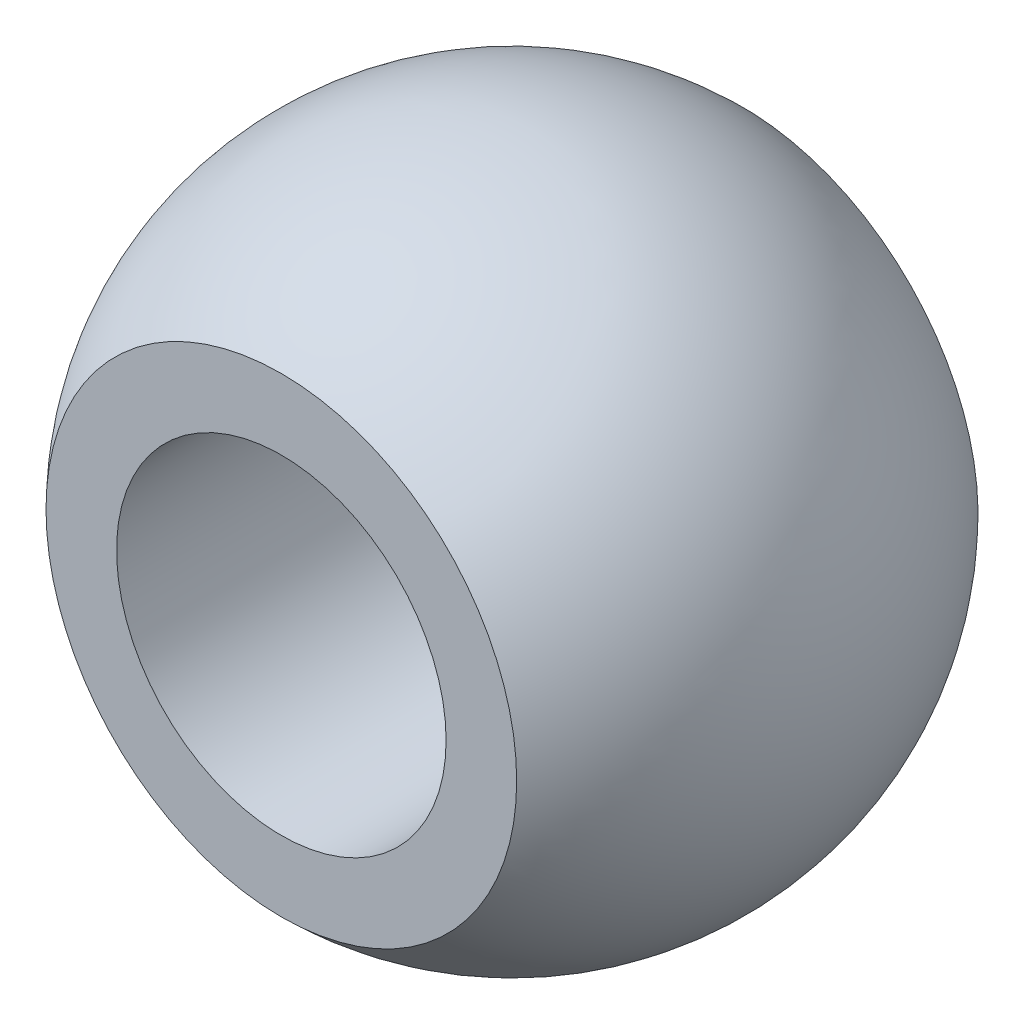
ISO-10303-21;
HEADER;
FILE_DESCRIPTION(('STEP AP214'),'2;1');
FILE_NAME('part.step','',(''),(''),'','','');
FILE_SCHEMA(('AUTOMOTIVE_DESIGN { 1 0 10303 214 1 1 1 1 }'));
ENDSEC;
DATA;
#1=APPLICATION_CONTEXT('core data for automotive mechanical design processes');
#2=APPLICATION_PROTOCOL_DEFINITION('international standard','automotive_design',2000,#1);
#3=PRODUCT_CONTEXT('',#1,'mechanical');
#4=PRODUCT('Part','Part','',(#3));
#5=PRODUCT_RELATED_PRODUCT_CATEGORY('part','',(#4));
#6=PRODUCT_DEFINITION_FORMATION('','',#4);
#7=PRODUCT_DEFINITION_CONTEXT('part definition',#1,'design');
#8=PRODUCT_DEFINITION('design','',#6,#7);
#9=PRODUCT_DEFINITION_SHAPE('','',#8);
#10=(LENGTH_UNIT() NAMED_UNIT(*) SI_UNIT(.MILLI.,.METRE.));
#11=(NAMED_UNIT(*) PLANE_ANGLE_UNIT() SI_UNIT($,.RADIAN.));
#12=(NAMED_UNIT(*) SI_UNIT($,.STERADIAN.) SOLID_ANGLE_UNIT());
#13=UNCERTAINTY_MEASURE_WITH_UNIT(LENGTH_MEASURE(1.E-05),#10,'distance_accuracy_value','');
#14=(GEOMETRIC_REPRESENTATION_CONTEXT(3) GLOBAL_UNCERTAINTY_ASSIGNED_CONTEXT((#13)) GLOBAL_UNIT_ASSIGNED_CONTEXT((#10,
#11,#12)) REPRESENTATION_CONTEXT('',''));
#15=CARTESIAN_POINT('',(0.,0.,0.));
#16=DIRECTION('',(0.,0.,1.));
#17=DIRECTION('',(1.,0.,0.));
#18=AXIS2_PLACEMENT_3D('',#15,#16,#17);
#19=CARTESIAN_POINT('',(0.,15.875,0.));
#20=DIRECTION('',(0.,-1.,0.));
#21=DIRECTION('',(-1.,0.,0.));
#22=AXIS2_PLACEMENT_3D('',#19,#20,#21);
#23=SPHERICAL_SURFACE('',#22,7.9375);
#24=CARTESIAN_POINT('',(0.,15.875,0.));
#25=DIRECTION('',(0.,0.,1.));
#26=DIRECTION('',(0.,-1.,0.));
#27=AXIS2_PLACEMENT_3D('',#24,#25,#26);
#28=SPHERICAL_SURFACE('',#27,7.9375);
#29=CARTESIAN_POINT('',(0.,15.875,-5.55625));
#30=DIRECTION('',(0.,0.,1.));
#31=DIRECTION('',(0.,-1.,0.));
#32=AXIS2_PLACEMENT_3D('',#29,#30,#31);
#33=CIRCLE('',#32,5.66850881515589);
#34=CARTESIAN_POINT('',(0.,10.2064911848441,-5.55625));
#35=VERTEX_POINT('',#34);
#36=EDGE_CURVE('E42',#35,#35,#33,.F.);
#37=ORIENTED_EDGE('',*,*,#36,.F.);
#38=EDGE_LOOP('',(#37));
#39=FACE_BOUND('',#38,.T.);
#40=CARTESIAN_POINT('',(0.,15.875,5.55625));
#41=DIRECTION('',(0.,0.,-1.));
#42=DIRECTION('',(0.,1.,0.));
#43=AXIS2_PLACEMENT_3D('',#40,#41,#42);
#44=CIRCLE('',#43,5.66850881515589);
#45=CARTESIAN_POINT('',(0.,21.5435088151559,5.55625));
#46=VERTEX_POINT('',#45);
#47=EDGE_CURVE('E10',#46,#46,#44,.F.);
#48=ORIENTED_EDGE('',*,*,#47,.F.);
#49=EDGE_LOOP('',(#48));
#50=FACE_BOUND('',#49,.T.);
#51=ADVANCED_FACE('F39',(#39,#50),#28,.T.);
#52=CARTESIAN_POINT('',(-11.1125,26.9875,5.55625));
#53=DIRECTION('',(0.,0.,-1.));
#54=DIRECTION('',(0.,1.,0.));
#55=AXIS2_PLACEMENT_3D('',#52,#53,#54);
#56=PLANE('',#55);
#57=CARTESIAN_POINT('',(0.,15.875,5.55625));
#58=DIRECTION('',(0.,0.,1.));
#59=DIRECTION('',(1.,0.,0.));
#60=AXIS2_PLACEMENT_3D('',#57,#58,#59);
#61=CIRCLE('',#60,3.96875);
#62=CARTESIAN_POINT('',(3.96875,15.875,5.55625));
#63=VERTEX_POINT('',#62);
#64=EDGE_CURVE('E53',#63,#63,#61,.T.);
#65=ORIENTED_EDGE('',*,*,#64,.F.);
#66=EDGE_LOOP('',(#65));
#67=FACE_BOUND('',#66,.T.);
#68=ORIENTED_EDGE('',*,*,#47,.T.);
#69=EDGE_LOOP('',(#68));
#70=FACE_BOUND('',#69,.T.);
#71=ADVANCED_FACE('F59',(#67,#70),#56,.F.);
#72=CARTESIAN_POINT('',(-11.1125,26.9875,-5.55625));
#73=DIRECTION('',(0.,0.,1.));
#74=DIRECTION('',(0.,-1.,0.));
#75=AXIS2_PLACEMENT_3D('',#72,#73,#74);
#76=PLANE('',#75);
#77=CARTESIAN_POINT('',(0.,15.875,-5.55625));
#78=DIRECTION('',(0.,0.,1.));
#79=DIRECTION('',(1.,0.,0.));
#80=AXIS2_PLACEMENT_3D('',#77,#78,#79);
#81=CIRCLE('',#80,3.96875);
#82=CARTESIAN_POINT('',(3.96875,15.875,-5.55625));
#83=VERTEX_POINT('',#82);
#84=EDGE_CURVE('E49',#83,#83,#81,.T.);
#85=ORIENTED_EDGE('',*,*,#84,.T.);
#86=EDGE_LOOP('',(#85));
#87=FACE_BOUND('',#86,.T.);
#88=ORIENTED_EDGE('',*,*,#36,.T.);
#89=EDGE_LOOP('',(#88));
#90=FACE_BOUND('',#89,.T.);
#91=ADVANCED_FACE('F61',(#87,#90),#76,.F.);
#92=CARTESIAN_POINT('',(0.,15.875,-5.55625));
#93=DIRECTION('',(0.,0.,1.));
#94=DIRECTION('',(1.,0.,0.));
#95=AXIS2_PLACEMENT_3D('',#92,#93,#94);
#96=CYLINDRICAL_SURFACE('',#95,3.96875);
#97=ORIENTED_EDGE('',*,*,#84,.F.);
#98=EDGE_LOOP('',(#97));
#99=FACE_BOUND('',#98,.T.);
#100=ORIENTED_EDGE('',*,*,#64,.T.);
#101=EDGE_LOOP('',(#100));
#102=FACE_BOUND('',#101,.T.);
#103=ADVANCED_FACE('F57',(#99,#102),#96,.F.);
#104=CLOSED_SHELL('',(#51,#71,#91,#103));
#105=MANIFOLD_SOLID_BREP('B2',#104);
#106=ADVANCED_BREP_SHAPE_REPRESENTATION('',(#18,#105),#14);
#107=SHAPE_DEFINITION_REPRESENTATION(#9,#106);
ENDSEC;
END-ISO-10303-21;
